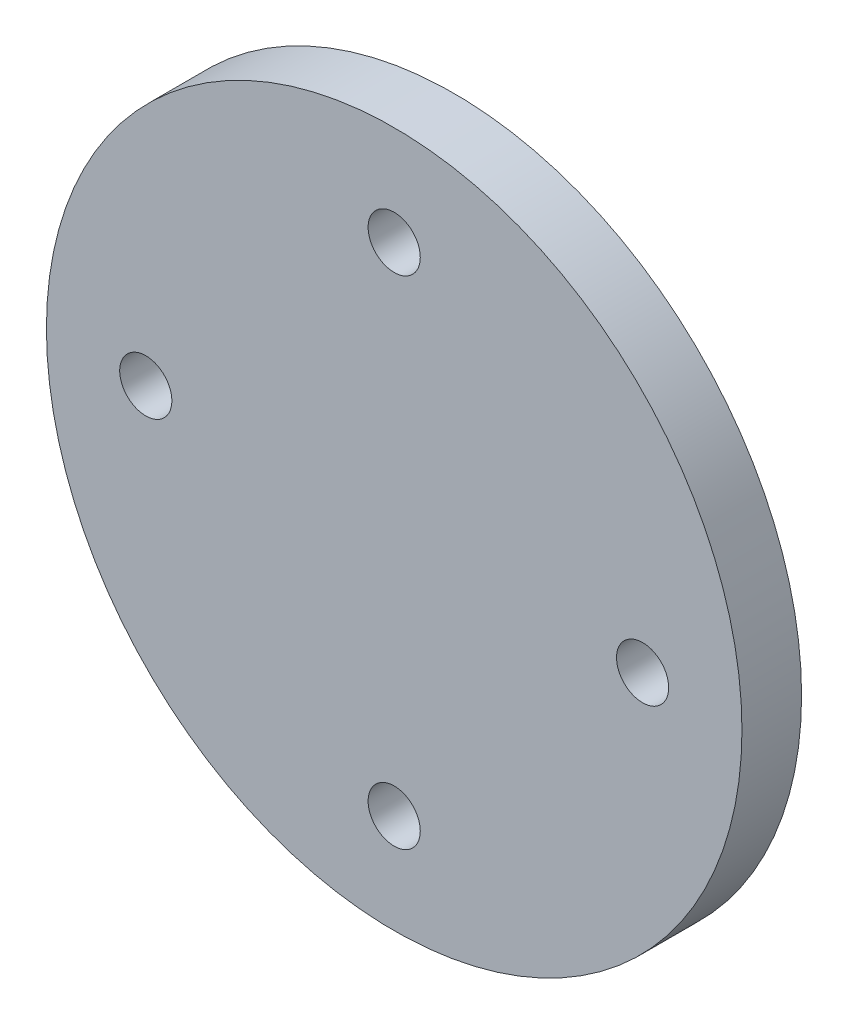
ISO-10303-21;
HEADER;
FILE_DESCRIPTION(('STEP AP214'),'2;1');
FILE_NAME('part.step','',(''),(''),'','','');
FILE_SCHEMA(('AUTOMOTIVE_DESIGN { 1 0 10303 214 1 1 1 1 }'));
ENDSEC;
DATA;
#1=APPLICATION_CONTEXT('core data for automotive mechanical design processes');
#2=APPLICATION_PROTOCOL_DEFINITION('international standard','automotive_design',2000,#1);
#3=PRODUCT_CONTEXT('',#1,'mechanical');
#4=PRODUCT('Part','Part','',(#3));
#5=PRODUCT_RELATED_PRODUCT_CATEGORY('part','',(#4));
#6=PRODUCT_DEFINITION_FORMATION('','',#4);
#7=PRODUCT_DEFINITION_CONTEXT('part definition',#1,'design');
#8=PRODUCT_DEFINITION('design','',#6,#7);
#9=PRODUCT_DEFINITION_SHAPE('','',#8);
#10=(LENGTH_UNIT() NAMED_UNIT(*) SI_UNIT(.MILLI.,.METRE.));
#11=(NAMED_UNIT(*) PLANE_ANGLE_UNIT() SI_UNIT($,.RADIAN.));
#12=(NAMED_UNIT(*) SI_UNIT($,.STERADIAN.) SOLID_ANGLE_UNIT());
#13=UNCERTAINTY_MEASURE_WITH_UNIT(LENGTH_MEASURE(1.E-05),#10,'distance_accuracy_value','');
#14=(GEOMETRIC_REPRESENTATION_CONTEXT(3) GLOBAL_UNCERTAINTY_ASSIGNED_CONTEXT((#13)) GLOBAL_UNIT_ASSIGNED_CONTEXT((#10,
#11,#12)) REPRESENTATION_CONTEXT('',''));
#15=CARTESIAN_POINT('',(0.,0.,0.));
#16=DIRECTION('',(0.,0.,1.));
#17=DIRECTION('',(1.,0.,0.));
#18=AXIS2_PLACEMENT_3D('',#15,#16,#17);
#19=CARTESIAN_POINT('',(0.,0.,12.));
#20=DIRECTION('',(0.,0.,-1.));
#21=DIRECTION('',(-1.,0.,0.));
#22=AXIS2_PLACEMENT_3D('',#19,#20,#21);
#23=CYLINDRICAL_SURFACE('',#22,70.);
#24=CARTESIAN_POINT('',(0.,0.,12.));
#25=DIRECTION('',(0.,0.,1.));
#26=DIRECTION('',(1.,0.,0.));
#27=AXIS2_PLACEMENT_3D('',#24,#25,#26);
#28=CIRCLE('',#27,70.);
#29=CARTESIAN_POINT('',(70.,0.,12.));
#30=VERTEX_POINT('',#29);
#31=EDGE_CURVE('E10',#30,#30,#28,.T.);
#32=ORIENTED_EDGE('',*,*,#31,.F.);
#33=EDGE_LOOP('',(#32));
#34=FACE_BOUND('',#33,.T.);
#35=CARTESIAN_POINT('',(0.,0.,0.));
#36=DIRECTION('',(0.,0.,1.));
#37=DIRECTION('',(1.,0.,0.));
#38=AXIS2_PLACEMENT_3D('',#35,#36,#37);
#39=CIRCLE('',#38,70.);
#40=CARTESIAN_POINT('',(70.,0.,0.));
#41=VERTEX_POINT('',#40);
#42=EDGE_CURVE('E36',#41,#41,#39,.T.);
#43=ORIENTED_EDGE('',*,*,#42,.T.);
#44=EDGE_LOOP('',(#43));
#45=FACE_BOUND('',#44,.T.);
#46=ADVANCED_FACE('F33',(#34,#45),#23,.T.);
#47=CARTESIAN_POINT('',(0.,0.,12.));
#48=DIRECTION('',(0.,0.,1.));
#49=DIRECTION('',(1.,0.,0.));
#50=AXIS2_PLACEMENT_3D('',#47,#48,#49);
#51=PLANE('',#50);
#52=CARTESIAN_POINT('',(-50.,5.2372220082647E-13,12.));
#53=DIRECTION('',(0.,0.,1.));
#54=DIRECTION('',(1.,0.,0.));
#55=AXIS2_PLACEMENT_3D('',#52,#53,#54);
#56=CIRCLE('',#55,5.25);
#57=CARTESIAN_POINT('',(-44.75,5.2372220082647E-13,12.));
#58=VERTEX_POINT('',#57);
#59=EDGE_CURVE('E65',#58,#58,#56,.T.);
#60=ORIENTED_EDGE('',*,*,#59,.F.);
#61=EDGE_LOOP('',(#60));
#62=FACE_BOUND('',#61,.T.);
#63=CARTESIAN_POINT('',(0.,-50.,12.));
#64=DIRECTION('',(0.,0.,1.));
#65=DIRECTION('',(1.,0.,0.));
#66=AXIS2_PLACEMENT_3D('',#63,#64,#65);
#67=CIRCLE('',#66,5.25);
#68=CARTESIAN_POINT('',(5.25,-50.,12.));
#69=VERTEX_POINT('',#68);
#70=EDGE_CURVE('E59',#69,#69,#67,.T.);
#71=ORIENTED_EDGE('',*,*,#70,.F.);
#72=EDGE_LOOP('',(#71));
#73=FACE_BOUND('',#72,.T.);
#74=CARTESIAN_POINT('',(50.,-1.74574066942157E-13,12.));
#75=DIRECTION('',(0.,0.,1.));
#76=DIRECTION('',(1.,0.,0.));
#77=AXIS2_PLACEMENT_3D('',#74,#75,#76);
#78=CIRCLE('',#77,5.25);
#79=CARTESIAN_POINT('',(55.25,-1.74574066942157E-13,12.));
#80=VERTEX_POINT('',#79);
#81=EDGE_CURVE('E53',#80,#80,#78,.T.);
#82=ORIENTED_EDGE('',*,*,#81,.F.);
#83=EDGE_LOOP('',(#82));
#84=FACE_BOUND('',#83,.T.);
#85=CARTESIAN_POINT('',(0.,50.,12.));
#86=DIRECTION('',(0.,0.,1.));
#87=DIRECTION('',(1.,0.,0.));
#88=AXIS2_PLACEMENT_3D('',#85,#86,#87);
#89=CIRCLE('',#88,5.25);
#90=CARTESIAN_POINT('',(5.25,50.,12.));
#91=VERTEX_POINT('',#90);
#92=EDGE_CURVE('E47',#91,#91,#89,.T.);
#93=ORIENTED_EDGE('',*,*,#92,.F.);
#94=EDGE_LOOP('',(#93));
#95=FACE_BOUND('',#94,.T.);
#96=ORIENTED_EDGE('',*,*,#31,.T.);
#97=EDGE_LOOP('',(#96));
#98=FACE_BOUND('',#97,.T.);
#99=ADVANCED_FACE('F71',(#62,#73,#84,#95,#98),#51,.T.);
#100=CARTESIAN_POINT('',(0.,0.,0.));
#101=DIRECTION('',(0.,0.,1.));
#102=DIRECTION('',(1.,0.,0.));
#103=AXIS2_PLACEMENT_3D('',#100,#101,#102);
#104=PLANE('',#103);
#105=CARTESIAN_POINT('',(-50.,5.2372220082647E-13,0.));
#106=DIRECTION('',(0.,0.,1.));
#107=DIRECTION('',(1.,0.,0.));
#108=AXIS2_PLACEMENT_3D('',#105,#106,#107);
#109=CIRCLE('',#108,5.25);
#110=CARTESIAN_POINT('',(-44.75,5.2372220082647E-13,0.));
#111=VERTEX_POINT('',#110);
#112=EDGE_CURVE('E62',#111,#111,#109,.T.);
#113=ORIENTED_EDGE('',*,*,#112,.T.);
#114=EDGE_LOOP('',(#113));
#115=FACE_BOUND('',#114,.T.);
#116=CARTESIAN_POINT('',(0.,-50.,0.));
#117=DIRECTION('',(0.,0.,1.));
#118=DIRECTION('',(1.,0.,0.));
#119=AXIS2_PLACEMENT_3D('',#116,#117,#118);
#120=CIRCLE('',#119,5.25);
#121=CARTESIAN_POINT('',(5.25,-50.,0.));
#122=VERTEX_POINT('',#121);
#123=EDGE_CURVE('E56',#122,#122,#120,.T.);
#124=ORIENTED_EDGE('',*,*,#123,.T.);
#125=EDGE_LOOP('',(#124));
#126=FACE_BOUND('',#125,.T.);
#127=CARTESIAN_POINT('',(50.,-1.74574066942157E-13,0.));
#128=DIRECTION('',(0.,0.,1.));
#129=DIRECTION('',(1.,0.,0.));
#130=AXIS2_PLACEMENT_3D('',#127,#128,#129);
#131=CIRCLE('',#130,5.25);
#132=CARTESIAN_POINT('',(55.25,-1.74574066942157E-13,0.));
#133=VERTEX_POINT('',#132);
#134=EDGE_CURVE('E50',#133,#133,#131,.T.);
#135=ORIENTED_EDGE('',*,*,#134,.T.);
#136=EDGE_LOOP('',(#135));
#137=FACE_BOUND('',#136,.T.);
#138=CARTESIAN_POINT('',(0.,50.,0.));
#139=DIRECTION('',(0.,0.,1.));
#140=DIRECTION('',(1.,0.,0.));
#141=AXIS2_PLACEMENT_3D('',#138,#139,#140);
#142=CIRCLE('',#141,5.25);
#143=CARTESIAN_POINT('',(5.25,50.,0.));
#144=VERTEX_POINT('',#143);
#145=EDGE_CURVE('E43',#144,#144,#142,.T.);
#146=ORIENTED_EDGE('',*,*,#145,.T.);
#147=EDGE_LOOP('',(#146));
#148=FACE_BOUND('',#147,.T.);
#149=ORIENTED_EDGE('',*,*,#42,.F.);
#150=EDGE_LOOP('',(#149));
#151=FACE_BOUND('',#150,.T.);
#152=ADVANCED_FACE('F74',(#115,#126,#137,#148,#151),#104,.F.);
#153=CARTESIAN_POINT('',(0.,50.,12.));
#154=DIRECTION('',(0.,0.,1.));
#155=DIRECTION('',(1.,0.,0.));
#156=AXIS2_PLACEMENT_3D('',#153,#154,#155);
#157=CYLINDRICAL_SURFACE('',#156,5.25);
#158=ORIENTED_EDGE('',*,*,#145,.F.);
#159=EDGE_LOOP('',(#158));
#160=FACE_BOUND('',#159,.T.);
#161=ORIENTED_EDGE('',*,*,#92,.T.);
#162=EDGE_LOOP('',(#161));
#163=FACE_BOUND('',#162,.T.);
#164=ADVANCED_FACE('F82',(#160,#163),#157,.F.);
#165=CARTESIAN_POINT('',(50.,-1.74574066942157E-13,12.));
#166=DIRECTION('',(0.,0.,1.));
#167=DIRECTION('',(1.,0.,0.));
#168=AXIS2_PLACEMENT_3D('',#165,#166,#167);
#169=CYLINDRICAL_SURFACE('',#168,5.25);
#170=ORIENTED_EDGE('',*,*,#134,.F.);
#171=EDGE_LOOP('',(#170));
#172=FACE_BOUND('',#171,.T.);
#173=ORIENTED_EDGE('',*,*,#81,.T.);
#174=EDGE_LOOP('',(#173));
#175=FACE_BOUND('',#174,.T.);
#176=ADVANCED_FACE('F84',(#172,#175),#169,.F.);
#177=CARTESIAN_POINT('',(0.,-50.,12.));
#178=DIRECTION('',(0.,0.,1.));
#179=DIRECTION('',(1.,0.,0.));
#180=AXIS2_PLACEMENT_3D('',#177,#178,#179);
#181=CYLINDRICAL_SURFACE('',#180,5.25);
#182=ORIENTED_EDGE('',*,*,#123,.F.);
#183=EDGE_LOOP('',(#182));
#184=FACE_BOUND('',#183,.T.);
#185=ORIENTED_EDGE('',*,*,#70,.T.);
#186=EDGE_LOOP('',(#185));
#187=FACE_BOUND('',#186,.T.);
#188=ADVANCED_FACE('F91',(#184,#187),#181,.F.);
#189=CARTESIAN_POINT('',(-50.,5.2372220082647E-13,12.));
#190=DIRECTION('',(0.,0.,1.));
#191=DIRECTION('',(1.,0.,0.));
#192=AXIS2_PLACEMENT_3D('',#189,#190,#191);
#193=CYLINDRICAL_SURFACE('',#192,5.25);
#194=ORIENTED_EDGE('',*,*,#112,.F.);
#195=EDGE_LOOP('',(#194));
#196=FACE_BOUND('',#195,.T.);
#197=ORIENTED_EDGE('',*,*,#59,.T.);
#198=EDGE_LOOP('',(#197));
#199=FACE_BOUND('',#198,.T.);
#200=ADVANCED_FACE('F69',(#196,#199),#193,.F.);
#201=CLOSED_SHELL('',(#46,#99,#152,#164,#176,#188,#200));
#202=MANIFOLD_SOLID_BREP('B2',#201);
#203=ADVANCED_BREP_SHAPE_REPRESENTATION('',(#18,#202),#14);
#204=SHAPE_DEFINITION_REPRESENTATION(#9,#203);
ENDSEC;
END-ISO-10303-21;
